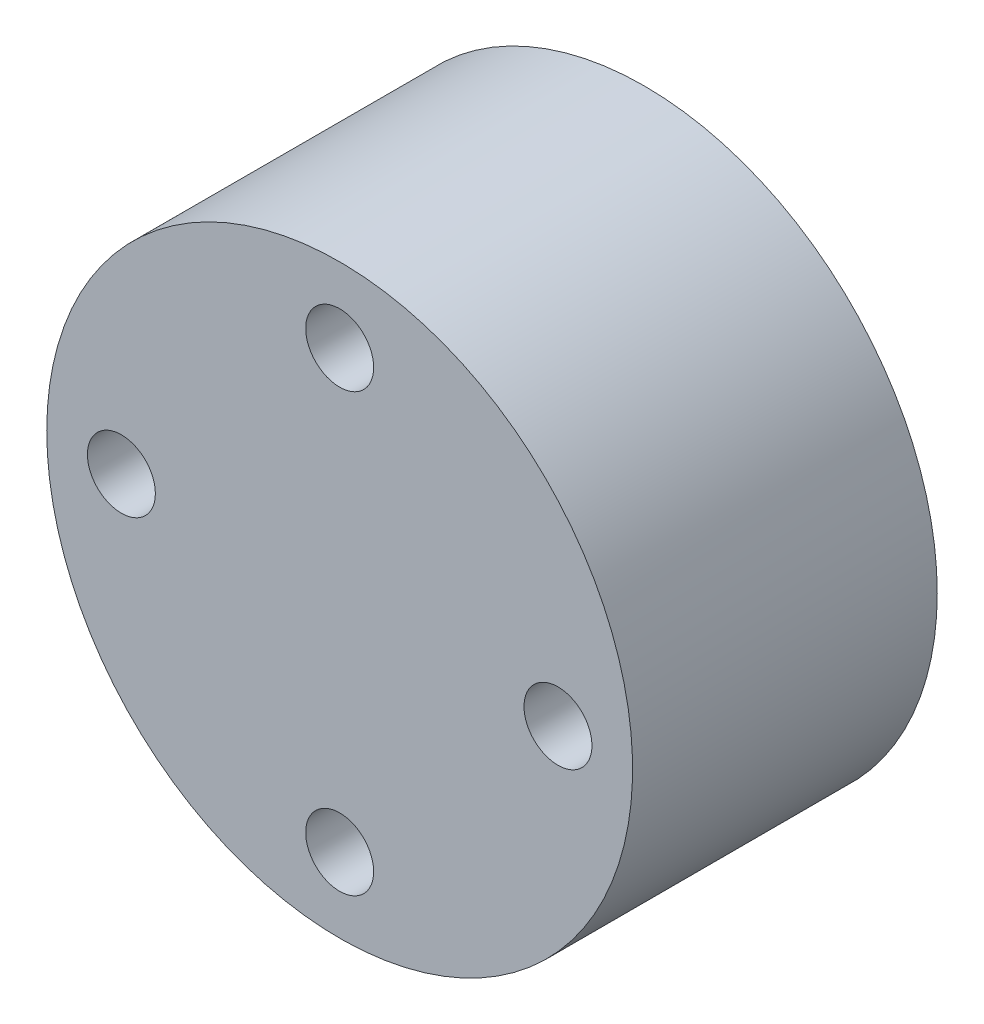
ISO-10303-21;
HEADER;
FILE_DESCRIPTION(('STEP AP214'),'2;1');
FILE_NAME('part.step','',(''),(''),'','','');
FILE_SCHEMA(('AUTOMOTIVE_DESIGN { 1 0 10303 214 1 1 1 1 }'));
ENDSEC;
DATA;
#1=APPLICATION_CONTEXT('core data for automotive mechanical design processes');
#2=APPLICATION_PROTOCOL_DEFINITION('international standard','automotive_design',2000,#1);
#3=PRODUCT_CONTEXT('',#1,'mechanical');
#4=PRODUCT('Part','Part','',(#3));
#5=PRODUCT_RELATED_PRODUCT_CATEGORY('part','',(#4));
#6=PRODUCT_DEFINITION_FORMATION('','',#4);
#7=PRODUCT_DEFINITION_CONTEXT('part definition',#1,'design');
#8=PRODUCT_DEFINITION('design','',#6,#7);
#9=PRODUCT_DEFINITION_SHAPE('','',#8);
#10=(LENGTH_UNIT() NAMED_UNIT(*) SI_UNIT(.MILLI.,.METRE.));
#11=(NAMED_UNIT(*) PLANE_ANGLE_UNIT() SI_UNIT($,.RADIAN.));
#12=(NAMED_UNIT(*) SI_UNIT($,.STERADIAN.) SOLID_ANGLE_UNIT());
#13=UNCERTAINTY_MEASURE_WITH_UNIT(LENGTH_MEASURE(1.E-05),#10,'distance_accuracy_value','');
#14=(GEOMETRIC_REPRESENTATION_CONTEXT(3) GLOBAL_UNCERTAINTY_ASSIGNED_CONTEXT((#13)) GLOBAL_UNIT_ASSIGNED_CONTEXT((#10,
#11,#12)) REPRESENTATION_CONTEXT('',''));
#15=CARTESIAN_POINT('',(0.,0.,0.));
#16=DIRECTION('',(0.,0.,1.));
#17=DIRECTION('',(1.,0.,0.));
#18=AXIS2_PLACEMENT_3D('',#15,#16,#17);
#19=CARTESIAN_POINT('',(0.,0.,5.));
#20=DIRECTION('',(0.,0.,-1.));
#21=DIRECTION('',(-1.,0.,0.));
#22=AXIS2_PLACEMENT_3D('',#19,#20,#21);
#23=CYLINDRICAL_SURFACE('',#22,12.5);
#24=CARTESIAN_POINT('',(0.,0.,-5.));
#25=DIRECTION('',(0.,0.,1.));
#26=DIRECTION('',(1.,0.,0.));
#27=AXIS2_PLACEMENT_3D('',#24,#25,#26);
#28=CIRCLE('',#27,12.5);
#29=CARTESIAN_POINT('',(12.5,0.,-5.));
#30=VERTEX_POINT('',#29);
#31=EDGE_CURVE('E10',#30,#30,#28,.T.);
#32=ORIENTED_EDGE('',*,*,#31,.T.);
#33=EDGE_LOOP('',(#32));
#34=FACE_BOUND('',#33,.T.);
#35=CARTESIAN_POINT('',(0.,0.,8.));
#36=DIRECTION('',(0.,0.,-1.));
#37=DIRECTION('',(-1.,0.,0.));
#38=AXIS2_PLACEMENT_3D('',#35,#36,#37);
#39=CIRCLE('',#38,12.5);
#40=CARTESIAN_POINT('',(-12.5,0.,8.));
#41=VERTEX_POINT('',#40);
#42=EDGE_CURVE('E38',#41,#41,#39,.T.);
#43=ORIENTED_EDGE('',*,*,#42,.T.);
#44=EDGE_LOOP('',(#43));
#45=FACE_BOUND('',#44,.T.);
#46=ADVANCED_FACE('F32',(#34,#45),#23,.T.);
#47=CARTESIAN_POINT('',(0.,0.,-5.));
#48=DIRECTION('',(0.,0.,1.));
#49=DIRECTION('',(1.,0.,0.));
#50=AXIS2_PLACEMENT_3D('',#47,#48,#49);
#51=PLANE('',#50);
#52=CARTESIAN_POINT('',(0.,8.,-5.));
#53=DIRECTION('',(0.,0.,-1.));
#54=DIRECTION('',(-1.,0.,0.));
#55=AXIS2_PLACEMENT_3D('',#52,#53,#54);
#56=CIRCLE('',#55,1.45);
#57=CARTESIAN_POINT('',(-1.45,8.,-5.));
#58=VERTEX_POINT('',#57);
#59=EDGE_CURVE('E88',#58,#58,#56,.T.);
#60=ORIENTED_EDGE('',*,*,#59,.F.);
#61=EDGE_LOOP('',(#60));
#62=FACE_BOUND('',#61,.T.);
#63=CARTESIAN_POINT('',(-8.,0.,-5.));
#64=DIRECTION('',(0.,0.,-1.));
#65=DIRECTION('',(-1.,0.,0.));
#66=AXIS2_PLACEMENT_3D('',#63,#64,#65);
#67=CIRCLE('',#66,1.45);
#68=CARTESIAN_POINT('',(-9.45,0.,-5.));
#69=VERTEX_POINT('',#68);
#70=EDGE_CURVE('E82',#69,#69,#67,.T.);
#71=ORIENTED_EDGE('',*,*,#70,.F.);
#72=EDGE_LOOP('',(#71));
#73=FACE_BOUND('',#72,.T.);
#74=CARTESIAN_POINT('',(0.,-8.,-5.));
#75=DIRECTION('',(0.,0.,-1.));
#76=DIRECTION('',(-1.,0.,0.));
#77=AXIS2_PLACEMENT_3D('',#74,#75,#76);
#78=CIRCLE('',#77,1.45);
#79=CARTESIAN_POINT('',(-1.45,-8.,-5.));
#80=VERTEX_POINT('',#79);
#81=EDGE_CURVE('E76',#80,#80,#78,.T.);
#82=ORIENTED_EDGE('',*,*,#81,.F.);
#83=EDGE_LOOP('',(#82));
#84=FACE_BOUND('',#83,.T.);
#85=CARTESIAN_POINT('',(8.,0.,-5.));
#86=DIRECTION('',(0.,0.,-1.));
#87=DIRECTION('',(-1.,0.,0.));
#88=AXIS2_PLACEMENT_3D('',#85,#86,#87);
#89=CIRCLE('',#88,1.45);
#90=CARTESIAN_POINT('',(6.55,0.,-5.));
#91=VERTEX_POINT('',#90);
#92=EDGE_CURVE('E70',#91,#91,#89,.T.);
#93=ORIENTED_EDGE('',*,*,#92,.F.);
#94=EDGE_LOOP('',(#93));
#95=FACE_BOUND('',#94,.T.);
#96=ORIENTED_EDGE('',*,*,#31,.F.);
#97=EDGE_LOOP('',(#96));
#98=FACE_BOUND('',#97,.T.);
#99=ADVANCED_FACE('F103',(#62,#73,#84,#95,#98),#51,.F.);
#100=CARTESIAN_POINT('',(0.,0.,8.));
#101=DIRECTION('',(0.,0.,1.));
#102=DIRECTION('',(1.,0.,0.));
#103=AXIS2_PLACEMENT_3D('',#100,#101,#102);
#104=PLANE('',#103);
#105=CARTESIAN_POINT('',(0.,9.315,8.));
#106=DIRECTION('',(0.,0.,1.));
#107=DIRECTION('',(1.,0.,0.));
#108=AXIS2_PLACEMENT_3D('',#105,#106,#107);
#109=CIRCLE('',#108,1.45);
#110=CARTESIAN_POINT('',(1.45000000000009,9.315,8.));
#111=VERTEX_POINT('',#110);
#112=EDGE_CURVE('E46',#111,#111,#109,.T.);
#113=ORIENTED_EDGE('',*,*,#112,.F.);
#114=EDGE_LOOP('',(#113));
#115=FACE_BOUND('',#114,.T.);
#116=CARTESIAN_POINT('',(9.315,-1.26623147733342E-13,8.));
#117=DIRECTION('',(0.,0.,1.));
#118=DIRECTION('',(1.,0.,0.));
#119=AXIS2_PLACEMENT_3D('',#116,#117,#118);
#120=CIRCLE('',#119,1.45);
#121=CARTESIAN_POINT('',(10.765,-1.26623147733342E-13,8.));
#122=VERTEX_POINT('',#121);
#123=EDGE_CURVE('E62',#122,#122,#120,.T.);
#124=ORIENTED_EDGE('',*,*,#123,.F.);
#125=EDGE_LOOP('',(#124));
#126=FACE_BOUND('',#125,.T.);
#127=CARTESIAN_POINT('',(-1.59146296404665E-13,-9.315,8.));
#128=DIRECTION('',(0.,0.,1.));
#129=DIRECTION('',(1.,0.,0.));
#130=AXIS2_PLACEMENT_3D('',#127,#128,#129);
#131=CIRCLE('',#130,1.45);
#132=CARTESIAN_POINT('',(1.44999999999984,-9.315,8.));
#133=VERTEX_POINT('',#132);
#134=EDGE_CURVE('E56',#133,#133,#131,.T.);
#135=ORIENTED_EDGE('',*,*,#134,.F.);
#136=EDGE_LOOP('',(#135));
#137=FACE_BOUND('',#136,.T.);
#138=CARTESIAN_POINT('',(-9.315,1.91669445075989E-13,8.));
#139=DIRECTION('',(0.,0.,1.));
#140=DIRECTION('',(1.,0.,0.));
#141=AXIS2_PLACEMENT_3D('',#138,#139,#140);
#142=CIRCLE('',#141,1.45);
#143=CARTESIAN_POINT('',(-7.865,1.91669445075989E-13,8.));
#144=VERTEX_POINT('',#143);
#145=EDGE_CURVE('E49',#144,#144,#142,.T.);
#146=ORIENTED_EDGE('',*,*,#145,.F.);
#147=EDGE_LOOP('',(#146));
#148=FACE_BOUND('',#147,.T.);
#149=ORIENTED_EDGE('',*,*,#42,.F.);
#150=EDGE_LOOP('',(#149));
#151=FACE_BOUND('',#150,.T.);
#152=ADVANCED_FACE('F106',(#115,#126,#137,#148,#151),#104,.T.);
#153=CARTESIAN_POINT('',(-9.315,1.91669445075989E-13,3.));
#154=DIRECTION('',(0.,0.,1.));
#155=DIRECTION('',(1.,0.,0.));
#156=AXIS2_PLACEMENT_3D('',#153,#154,#155);
#157=CYLINDRICAL_SURFACE('',#156,1.45);
#158=CARTESIAN_POINT('',(-9.315,1.91669445075989E-13,3.));
#159=DIRECTION('',(0.,0.,1.));
#160=DIRECTION('',(1.,0.,0.));
#161=AXIS2_PLACEMENT_3D('',#158,#159,#160);
#162=CIRCLE('',#161,1.45);
#163=CARTESIAN_POINT('',(-7.865,1.91669445075989E-13,3.));
#164=VERTEX_POINT('',#163);
#165=EDGE_CURVE('E52',#164,#164,#162,.T.);
#166=ORIENTED_EDGE('',*,*,#165,.F.);
#167=EDGE_LOOP('',(#166));
#168=FACE_BOUND('',#167,.T.);
#169=ORIENTED_EDGE('',*,*,#145,.T.);
#170=EDGE_LOOP('',(#169));
#171=FACE_BOUND('',#170,.T.);
#172=ADVANCED_FACE('F145',(#168,#171),#157,.F.);
#173=CARTESIAN_POINT('',(-9.315,1.91669445075989E-13,3.));
#174=DIRECTION('',(0.,0.,1.));
#175=DIRECTION('',(1.,0.,0.));
#176=AXIS2_PLACEMENT_3D('',#173,#174,#175);
#177=PLANE('',#176);
#178=ORIENTED_EDGE('',*,*,#165,.T.);
#179=EDGE_LOOP('',(#178));
#180=FACE_BOUND('',#179,.T.);
#181=ADVANCED_FACE('F153',(#180),#177,.T.);
#182=CARTESIAN_POINT('',(-1.59146296404665E-13,-9.315,3.));
#183=DIRECTION('',(0.,0.,1.));
#184=DIRECTION('',(1.,0.,0.));
#185=AXIS2_PLACEMENT_3D('',#182,#183,#184);
#186=CYLINDRICAL_SURFACE('',#185,1.45);
#187=CARTESIAN_POINT('',(-1.59146296404665E-13,-9.315,3.));
#188=DIRECTION('',(0.,0.,1.));
#189=DIRECTION('',(1.,0.,0.));
#190=AXIS2_PLACEMENT_3D('',#187,#188,#189);
#191=CIRCLE('',#190,1.45);
#192=CARTESIAN_POINT('',(1.44999999999984,-9.315,3.));
#193=VERTEX_POINT('',#192);
#194=EDGE_CURVE('E59',#193,#193,#191,.T.);
#195=ORIENTED_EDGE('',*,*,#194,.F.);
#196=EDGE_LOOP('',(#195));
#197=FACE_BOUND('',#196,.T.);
#198=ORIENTED_EDGE('',*,*,#134,.T.);
#199=EDGE_LOOP('',(#198));
#200=FACE_BOUND('',#199,.T.);
#201=ADVANCED_FACE('F161',(#197,#200),#186,.F.);
#202=CARTESIAN_POINT('',(-1.59146296404665E-13,-9.315,3.));
#203=DIRECTION('',(0.,0.,1.));
#204=DIRECTION('',(1.,0.,0.));
#205=AXIS2_PLACEMENT_3D('',#202,#203,#204);
#206=PLANE('',#205);
#207=ORIENTED_EDGE('',*,*,#194,.T.);
#208=EDGE_LOOP('',(#207));
#209=FACE_BOUND('',#208,.T.);
#210=ADVANCED_FACE('F169',(#209),#206,.T.);
#211=CARTESIAN_POINT('',(9.315,-1.26623147733342E-13,3.));
#212=DIRECTION('',(0.,0.,1.));
#213=DIRECTION('',(1.,0.,0.));
#214=AXIS2_PLACEMENT_3D('',#211,#212,#213);
#215=CYLINDRICAL_SURFACE('',#214,1.45);
#216=CARTESIAN_POINT('',(9.315,-1.26623147733342E-13,3.));
#217=DIRECTION('',(0.,0.,1.));
#218=DIRECTION('',(1.,0.,0.));
#219=AXIS2_PLACEMENT_3D('',#216,#217,#218);
#220=CIRCLE('',#219,1.45);
#221=CARTESIAN_POINT('',(10.765,-1.26623147733342E-13,3.));
#222=VERTEX_POINT('',#221);
#223=EDGE_CURVE('E65',#222,#222,#220,.T.);
#224=ORIENTED_EDGE('',*,*,#223,.F.);
#225=EDGE_LOOP('',(#224));
#226=FACE_BOUND('',#225,.T.);
#227=ORIENTED_EDGE('',*,*,#123,.T.);
#228=EDGE_LOOP('',(#227));
#229=FACE_BOUND('',#228,.T.);
#230=ADVANCED_FACE('F177',(#226,#229),#215,.F.);
#231=CARTESIAN_POINT('',(9.315,-1.26623147733342E-13,3.));
#232=DIRECTION('',(0.,0.,1.));
#233=DIRECTION('',(1.,0.,0.));
#234=AXIS2_PLACEMENT_3D('',#231,#232,#233);
#235=PLANE('',#234);
#236=ORIENTED_EDGE('',*,*,#223,.T.);
#237=EDGE_LOOP('',(#236));
#238=FACE_BOUND('',#237,.T.);
#239=ADVANCED_FACE('F185',(#238),#235,.T.);
#240=CARTESIAN_POINT('',(0.,9.315,3.));
#241=DIRECTION('',(0.,0.,1.));
#242=DIRECTION('',(1.,0.,0.));
#243=AXIS2_PLACEMENT_3D('',#240,#241,#242);
#244=CYLINDRICAL_SURFACE('',#243,1.45);
#245=CARTESIAN_POINT('',(0.,9.315,3.));
#246=DIRECTION('',(0.,0.,1.));
#247=DIRECTION('',(1.,0.,0.));
#248=AXIS2_PLACEMENT_3D('',#245,#246,#247);
#249=CIRCLE('',#248,1.45);
#250=CARTESIAN_POINT('',(1.45000000000009,9.315,3.));
#251=VERTEX_POINT('',#250);
#252=EDGE_CURVE('E42',#251,#251,#249,.T.);
#253=ORIENTED_EDGE('',*,*,#252,.F.);
#254=EDGE_LOOP('',(#253));
#255=FACE_BOUND('',#254,.T.);
#256=ORIENTED_EDGE('',*,*,#112,.T.);
#257=EDGE_LOOP('',(#256));
#258=FACE_BOUND('',#257,.T.);
#259=ADVANCED_FACE('F127',(#255,#258),#244,.F.);
#260=CARTESIAN_POINT('',(0.,9.315,3.));
#261=DIRECTION('',(0.,0.,1.));
#262=DIRECTION('',(1.,0.,0.));
#263=AXIS2_PLACEMENT_3D('',#260,#261,#262);
#264=PLANE('',#263);
#265=ORIENTED_EDGE('',*,*,#252,.T.);
#266=EDGE_LOOP('',(#265));
#267=FACE_BOUND('',#266,.T.);
#268=ADVANCED_FACE('F117',(#267),#264,.T.);
#269=CARTESIAN_POINT('',(8.,0.,0.));
#270=DIRECTION('',(0.,0.,-1.));
#271=DIRECTION('',(-1.,0.,0.));
#272=AXIS2_PLACEMENT_3D('',#269,#270,#271);
#273=CYLINDRICAL_SURFACE('',#272,1.45);
#274=CARTESIAN_POINT('',(8.,0.,0.));
#275=DIRECTION('',(0.,0.,-1.));
#276=DIRECTION('',(-1.,0.,0.));
#277=AXIS2_PLACEMENT_3D('',#274,#275,#276);
#278=CIRCLE('',#277,1.45);
#279=CARTESIAN_POINT('',(6.55,0.,0.));
#280=VERTEX_POINT('',#279);
#281=EDGE_CURVE('E73',#280,#280,#278,.T.);
#282=ORIENTED_EDGE('',*,*,#281,.F.);
#283=EDGE_LOOP('',(#282));
#284=FACE_BOUND('',#283,.T.);
#285=ORIENTED_EDGE('',*,*,#92,.T.);
#286=EDGE_LOOP('',(#285));
#287=FACE_BOUND('',#286,.T.);
#288=ADVANCED_FACE('F114',(#284,#287),#273,.F.);
#289=CARTESIAN_POINT('',(8.,0.,0.));
#290=DIRECTION('',(0.,0.,-1.));
#291=DIRECTION('',(-1.,0.,0.));
#292=AXIS2_PLACEMENT_3D('',#289,#290,#291);
#293=PLANE('',#292);
#294=ORIENTED_EDGE('',*,*,#281,.T.);
#295=EDGE_LOOP('',(#294));
#296=FACE_BOUND('',#295,.T.);
#297=ADVANCED_FACE('F116',(#296),#293,.T.);
#298=CARTESIAN_POINT('',(0.,-8.,0.));
#299=DIRECTION('',(0.,0.,-1.));
#300=DIRECTION('',(-1.,0.,0.));
#301=AXIS2_PLACEMENT_3D('',#298,#299,#300);
#302=CYLINDRICAL_SURFACE('',#301,1.45);
#303=CARTESIAN_POINT('',(0.,-8.,0.));
#304=DIRECTION('',(0.,0.,-1.));
#305=DIRECTION('',(-1.,0.,0.));
#306=AXIS2_PLACEMENT_3D('',#303,#304,#305);
#307=CIRCLE('',#306,1.45);
#308=CARTESIAN_POINT('',(-1.45,-8.,0.));
#309=VERTEX_POINT('',#308);
#310=EDGE_CURVE('E79',#309,#309,#307,.T.);
#311=ORIENTED_EDGE('',*,*,#310,.F.);
#312=EDGE_LOOP('',(#311));
#313=FACE_BOUND('',#312,.T.);
#314=ORIENTED_EDGE('',*,*,#81,.T.);
#315=EDGE_LOOP('',(#314));
#316=FACE_BOUND('',#315,.T.);
#317=ADVANCED_FACE('F124',(#313,#316),#302,.F.);
#318=CARTESIAN_POINT('',(0.,-8.,0.));
#319=DIRECTION('',(0.,0.,-1.));
#320=DIRECTION('',(-1.,0.,0.));
#321=AXIS2_PLACEMENT_3D('',#318,#319,#320);
#322=PLANE('',#321);
#323=ORIENTED_EDGE('',*,*,#310,.T.);
#324=EDGE_LOOP('',(#323));
#325=FACE_BOUND('',#324,.T.);
#326=ADVANCED_FACE('F225',(#325),#322,.T.);
#327=CARTESIAN_POINT('',(-8.,0.,0.));
#328=DIRECTION('',(0.,0.,-1.));
#329=DIRECTION('',(-1.,0.,0.));
#330=AXIS2_PLACEMENT_3D('',#327,#328,#329);
#331=CYLINDRICAL_SURFACE('',#330,1.45);
#332=CARTESIAN_POINT('',(-8.,0.,0.));
#333=DIRECTION('',(0.,0.,-1.));
#334=DIRECTION('',(-1.,0.,0.));
#335=AXIS2_PLACEMENT_3D('',#332,#333,#334);
#336=CIRCLE('',#335,1.45);
#337=CARTESIAN_POINT('',(-9.45,0.,0.));
#338=VERTEX_POINT('',#337);
#339=EDGE_CURVE('E85',#338,#338,#336,.T.);
#340=ORIENTED_EDGE('',*,*,#339,.F.);
#341=EDGE_LOOP('',(#340));
#342=FACE_BOUND('',#341,.T.);
#343=ORIENTED_EDGE('',*,*,#70,.T.);
#344=EDGE_LOOP('',(#343));
#345=FACE_BOUND('',#344,.T.);
#346=ADVANCED_FACE('F234',(#342,#345),#331,.F.);
#347=CARTESIAN_POINT('',(-8.,0.,0.));
#348=DIRECTION('',(0.,0.,-1.));
#349=DIRECTION('',(-1.,0.,0.));
#350=AXIS2_PLACEMENT_3D('',#347,#348,#349);
#351=PLANE('',#350);
#352=ORIENTED_EDGE('',*,*,#339,.T.);
#353=EDGE_LOOP('',(#352));
#354=FACE_BOUND('',#353,.T.);
#355=ADVANCED_FACE('F99',(#354),#351,.T.);
#356=CARTESIAN_POINT('',(0.,8.,0.));
#357=DIRECTION('',(0.,0.,-1.));
#358=DIRECTION('',(-1.,0.,0.));
#359=AXIS2_PLACEMENT_3D('',#356,#357,#358);
#360=CYLINDRICAL_SURFACE('',#359,1.45);
#361=CARTESIAN_POINT('',(0.,8.,0.));
#362=DIRECTION('',(0.,0.,-1.));
#363=DIRECTION('',(-1.,0.,0.));
#364=AXIS2_PLACEMENT_3D('',#361,#362,#363);
#365=CIRCLE('',#364,1.45);
#366=CARTESIAN_POINT('',(-1.45,8.,0.));
#367=VERTEX_POINT('',#366);
#368=EDGE_CURVE('E53',#367,#367,#365,.T.);
#369=ORIENTED_EDGE('',*,*,#368,.F.);
#370=EDGE_LOOP('',(#369));
#371=FACE_BOUND('',#370,.T.);
#372=ORIENTED_EDGE('',*,*,#59,.T.);
#373=EDGE_LOOP('',(#372));
#374=FACE_BOUND('',#373,.T.);
#375=ADVANCED_FACE('F96',(#371,#374),#360,.F.);
#376=CARTESIAN_POINT('',(0.,8.,0.));
#377=DIRECTION('',(0.,0.,-1.));
#378=DIRECTION('',(-1.,0.,0.));
#379=AXIS2_PLACEMENT_3D('',#376,#377,#378);
#380=PLANE('',#379);
#381=ORIENTED_EDGE('',*,*,#368,.T.);
#382=EDGE_LOOP('',(#381));
#383=FACE_BOUND('',#382,.T.);
#384=ADVANCED_FACE('F94',(#383),#380,.T.);
#385=CLOSED_SHELL('',(#46,#99,#152,#172,#181,#201,#210,#230,#239,#259,#268,#288,#297,#317,#326,
#346,#355,#375,#384));
#386=MANIFOLD_SOLID_BREP('B2',#385);
#387=ADVANCED_BREP_SHAPE_REPRESENTATION('',(#18,#386),#14);
#388=SHAPE_DEFINITION_REPRESENTATION(#9,#387);
ENDSEC;
END-ISO-10303-21;
